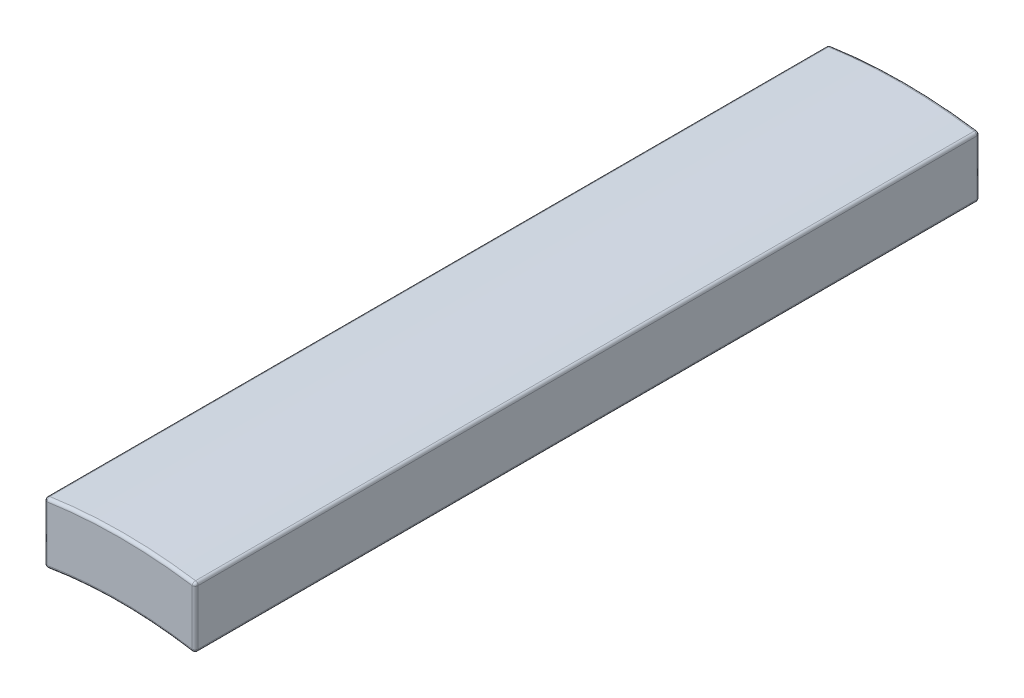
ISO-10303-21;
HEADER;
FILE_DESCRIPTION(('STEP AP214'),'2;1');
FILE_NAME('part.step','',(''),(''),'','','');
FILE_SCHEMA(('AUTOMOTIVE_DESIGN { 1 0 10303 214 1 1 1 1 }'));
ENDSEC;
DATA;
#1=APPLICATION_CONTEXT('core data for automotive mechanical design processes');
#2=APPLICATION_PROTOCOL_DEFINITION('international standard','automotive_design',2000,#1);
#3=PRODUCT_CONTEXT('',#1,'mechanical');
#4=PRODUCT('Part','Part','',(#3));
#5=PRODUCT_RELATED_PRODUCT_CATEGORY('part','',(#4));
#6=PRODUCT_DEFINITION_FORMATION('','',#4);
#7=PRODUCT_DEFINITION_CONTEXT('part definition',#1,'design');
#8=PRODUCT_DEFINITION('design','',#6,#7);
#9=PRODUCT_DEFINITION_SHAPE('','',#8);
#10=(LENGTH_UNIT() NAMED_UNIT(*) SI_UNIT(.MILLI.,.METRE.));
#11=(NAMED_UNIT(*) PLANE_ANGLE_UNIT() SI_UNIT($,.RADIAN.));
#12=(NAMED_UNIT(*) SI_UNIT($,.STERADIAN.) SOLID_ANGLE_UNIT());
#13=UNCERTAINTY_MEASURE_WITH_UNIT(LENGTH_MEASURE(1.E-05),#10,'distance_accuracy_value','');
#14=(GEOMETRIC_REPRESENTATION_CONTEXT(3) GLOBAL_UNCERTAINTY_ASSIGNED_CONTEXT((#13)) GLOBAL_UNIT_ASSIGNED_CONTEXT((#10,
#11,#12)) REPRESENTATION_CONTEXT('',''));
#15=CARTESIAN_POINT('',(0.,0.,0.));
#16=DIRECTION('',(0.,0.,1.));
#17=DIRECTION('',(1.,0.,0.));
#18=AXIS2_PLACEMENT_3D('',#15,#16,#17);
#19=CARTESIAN_POINT('',(2.4,14.3,0.1));
#20=DIRECTION('',(0.,1.,0.));
#21=DIRECTION('',(0.,0.,1.));
#22=AXIS2_PLACEMENT_3D('',#19,#20,#21);
#23=CYLINDRICAL_SURFACE('',#22,0.1);
#24=CARTESIAN_POINT('',(2.4,14.3,0.1));
#25=DIRECTION('',(0.,1.,0.));
#26=DIRECTION('',(0.,0.,1.));
#27=AXIS2_PLACEMENT_3D('',#24,#25,#26);
#28=CIRCLE('',#27,0.1);
#29=CARTESIAN_POINT('',(2.5,14.3,0.100000000000006));
#30=VERTEX_POINT('',#29);
#31=CARTESIAN_POINT('',(2.4,14.3,0.));
#32=VERTEX_POINT('',#31);
#33=EDGE_CURVE('E28',#30,#32,#28,.T.);
#34=ORIENTED_EDGE('',*,*,#33,.T.);
#35=DIRECTION('',(0.,-1.,0.));
#36=VECTOR('',#35,1.);
#37=CARTESIAN_POINT('',(2.4,14.3,0.));
#38=LINE('',#37,#36);
#39=CARTESIAN_POINT('',(2.4,16.1223447426235,0.));
#40=VERTEX_POINT('',#39);
#41=EDGE_CURVE('E205',#40,#32,#38,.T.);
#42=ORIENTED_EDGE('',*,*,#41,.F.);
#43=CARTESIAN_POINT('',(2.4,16.1223447426235,0.1));
#44=DIRECTION('',(0.,-1.,0.));
#45=DIRECTION('',(0.,0.,-1.));
#46=AXIS2_PLACEMENT_3D('',#43,#44,#45);
#47=CIRCLE('',#46,0.1);
#48=CARTESIAN_POINT('',(2.5,16.1223447426235,0.100000000000006));
#49=VERTEX_POINT('',#48);
#50=EDGE_CURVE('E11',#40,#49,#47,.T.);
#51=ORIENTED_EDGE('',*,*,#50,.T.);
#52=DIRECTION('',(0.,1.,0.));
#53=VECTOR('',#52,1.);
#54=CARTESIAN_POINT('',(2.5,14.3,0.1));
#55=LINE('',#54,#53);
#56=EDGE_CURVE('E192',#30,#49,#55,.T.);
#57=ORIENTED_EDGE('',*,*,#56,.F.);
#58=EDGE_LOOP('',(#34,#42,#51,#57));
#59=FACE_BOUND('',#58,.T.);
#60=ADVANCED_FACE('F17',(#59),#23,.T.);
#61=CARTESIAN_POINT('',(2.4,16.1223447426235,0.1));
#62=DIRECTION('',(0.,1.,0.));
#63=DIRECTION('',(1.,0.,0.));
#64=AXIS2_PLACEMENT_3D('',#61,#62,#63);
#65=SPHERICAL_SURFACE('',#64,0.1);
#66=CARTESIAN_POINT('',(2.4,16.1223447426235,0.1));
#67=DIRECTION('',(0.98910090445543,-0.147239263803684,0.));
#68=DIRECTION('',(0.147239263803684,0.98910090445543,0.));
#69=AXIS2_PLACEMENT_3D('',#66,#67,#68);
#70=CIRCLE('',#69,0.1);
#71=CARTESIAN_POINT('',(2.41472392638037,16.2212548330691,0.100000000000006));
#72=VERTEX_POINT('',#71);
#73=EDGE_CURVE('E151',#40,#72,#70,.T.);
#74=ORIENTED_EDGE('',*,*,#73,.T.);
#75=CARTESIAN_POINT('',(2.4,16.1223447426235,0.1));
#76=DIRECTION('',(0.,0.,1.));
#77=DIRECTION('',(-1.,0.,0.));
#78=AXIS2_PLACEMENT_3D('',#75,#76,#77);
#79=CIRCLE('',#78,0.1);
#80=EDGE_CURVE('E188',#49,#72,#79,.T.);
#81=ORIENTED_EDGE('',*,*,#80,.F.);
#82=ORIENTED_EDGE('',*,*,#50,.F.);
#83=EDGE_LOOP('',(#74,#81,#82));
#84=FACE_BOUND('',#83,.T.);
#85=ADVANCED_FACE('F531',(#84),#65,.T.);
#86=CARTESIAN_POINT('',(2.4,14.3,0.1));
#87=DIRECTION('',(0.,1.,0.));
#88=DIRECTION('',(1.,0.,0.));
#89=AXIS2_PLACEMENT_3D('',#86,#87,#88);
#90=SPHERICAL_SURFACE('',#89,0.1);
#91=CARTESIAN_POINT('',(2.4,14.3,0.1));
#92=DIRECTION('',(0.,0.,1.));
#93=DIRECTION('',(-1.,0.,0.));
#94=AXIS2_PLACEMENT_3D('',#91,#92,#93);
#95=CIRCLE('',#94,0.1);
#96=CARTESIAN_POINT('',(2.38344827586207,14.2013793103448,0.100000000000006));
#97=VERTEX_POINT('',#96);
#98=EDGE_CURVE('E269',#97,#30,#95,.T.);
#99=ORIENTED_EDGE('',*,*,#98,.F.);
#100=CARTESIAN_POINT('',(2.4,14.3,0.1));
#101=DIRECTION('',(0.986206896551724,-0.165517241379312,0.));
#102=DIRECTION('',(0.165517241379312,0.986206896551724,0.));
#103=AXIS2_PLACEMENT_3D('',#100,#101,#102);
#104=CIRCLE('',#103,0.1);
#105=EDGE_CURVE('E283',#97,#32,#104,.T.);
#106=ORIENTED_EDGE('',*,*,#105,.T.);
#107=ORIENTED_EDGE('',*,*,#33,.F.);
#108=EDGE_LOOP('',(#99,#106,#107));
#109=FACE_BOUND('',#108,.T.);
#110=ADVANCED_FACE('F525',(#109),#90,.T.);
#111=CARTESIAN_POINT('',(0.,0.,0.1));
#112=DIRECTION('',(0.,0.,1.));
#113=DIRECTION('',(1.,0.,0.));
#114=AXIS2_PLACEMENT_3D('',#111,#112,#113);
#115=TOROIDAL_SURFACE('',#114,16.3,0.1);
#116=CARTESIAN_POINT('',(-2.4,16.1223447426235,0.1));
#117=DIRECTION('',(0.98910090445543,0.14723926380368,0.));
#118=DIRECTION('',(-0.14723926380368,0.98910090445543,0.));
#119=AXIS2_PLACEMENT_3D('',#116,#117,#118);
#120=CIRCLE('',#119,0.1);
#121=CARTESIAN_POINT('',(-2.4,16.1223447426235,0.));
#122=VERTEX_POINT('',#121);
#123=CARTESIAN_POINT('',(-2.41472392638037,16.2212548330691,0.100000000000006));
#124=VERTEX_POINT('',#123);
#125=EDGE_CURVE('E133',#122,#124,#120,.T.);
#126=ORIENTED_EDGE('',*,*,#125,.T.);
#127=CARTESIAN_POINT('',(0.,0.,0.1));
#128=DIRECTION('',(0.,0.,1.));
#129=DIRECTION('',(1.,0.,0.));
#130=AXIS2_PLACEMENT_3D('',#127,#128,#129);
#131=CIRCLE('',#130,16.4);
#132=EDGE_CURVE('E177',#72,#124,#131,.T.);
#133=ORIENTED_EDGE('',*,*,#132,.F.);
#134=ORIENTED_EDGE('',*,*,#73,.F.);
#135=CARTESIAN_POINT('',(0.,0.,0.));
#136=DIRECTION('',(0.,0.,-1.));
#137=DIRECTION('',(1.,0.,0.));
#138=AXIS2_PLACEMENT_3D('',#135,#136,#137);
#139=CIRCLE('',#138,16.3);
#140=EDGE_CURVE('E210',#122,#40,#139,.T.);
#141=ORIENTED_EDGE('',*,*,#140,.F.);
#142=EDGE_LOOP('',(#126,#133,#134,#141));
#143=FACE_BOUND('',#142,.T.);
#144=ADVANCED_FACE('F530',(#143),#115,.T.);
#145=CARTESIAN_POINT('',(0.,0.,0.1));
#146=DIRECTION('',(0.,0.,1.));
#147=DIRECTION('',(1.,0.,0.));
#148=AXIS2_PLACEMENT_3D('',#145,#146,#147);
#149=TOROIDAL_SURFACE('',#148,14.5,0.1);
#150=CARTESIAN_POINT('',(-2.4,14.3,0.1));
#151=DIRECTION('',(0.986206896551723,0.165517241379316,0.));
#152=DIRECTION('',(-0.165517241379316,0.986206896551723,0.));
#153=AXIS2_PLACEMENT_3D('',#150,#151,#152);
#154=CIRCLE('',#153,0.1);
#155=CARTESIAN_POINT('',(-2.38344827586207,14.2013793103448,0.100000000000006));
#156=VERTEX_POINT('',#155);
#157=CARTESIAN_POINT('',(-2.4,14.3,0.));
#158=VERTEX_POINT('',#157);
#159=EDGE_CURVE('E43',#156,#158,#154,.T.);
#160=ORIENTED_EDGE('',*,*,#159,.T.);
#161=CARTESIAN_POINT('',(0.,0.,0.));
#162=DIRECTION('',(0.,0.,1.));
#163=DIRECTION('',(1.,0.,0.));
#164=AXIS2_PLACEMENT_3D('',#161,#162,#163);
#165=CIRCLE('',#164,14.5);
#166=EDGE_CURVE('E209',#32,#158,#165,.T.);
#167=ORIENTED_EDGE('',*,*,#166,.F.);
#168=ORIENTED_EDGE('',*,*,#105,.F.);
#169=CARTESIAN_POINT('',(0.,0.,0.1));
#170=DIRECTION('',(0.,0.,-1.));
#171=DIRECTION('',(1.,0.,0.));
#172=AXIS2_PLACEMENT_3D('',#169,#170,#171);
#173=CIRCLE('',#172,14.4);
#174=EDGE_CURVE('E294',#156,#97,#173,.T.);
#175=ORIENTED_EDGE('',*,*,#174,.F.);
#176=EDGE_LOOP('',(#160,#167,#168,#175));
#177=FACE_BOUND('',#176,.T.);
#178=ADVANCED_FACE('F19',(#177),#149,.T.);
#179=CARTESIAN_POINT('',(-2.4,16.1223447426235,0.1));
#180=DIRECTION('',(0.,1.,0.));
#181=DIRECTION('',(1.,0.,0.));
#182=AXIS2_PLACEMENT_3D('',#179,#180,#181);
#183=SPHERICAL_SURFACE('',#182,0.1);
#184=CARTESIAN_POINT('',(-2.4,16.1223447426235,0.1));
#185=DIRECTION('',(0.,1.,0.));
#186=DIRECTION('',(0.,0.,1.));
#187=AXIS2_PLACEMENT_3D('',#184,#185,#186);
#188=CIRCLE('',#187,0.1);
#189=CARTESIAN_POINT('',(-2.5,16.1223447426235,0.100000000000006));
#190=VERTEX_POINT('',#189);
#191=EDGE_CURVE('E244',#122,#190,#188,.T.);
#192=ORIENTED_EDGE('',*,*,#191,.T.);
#193=CARTESIAN_POINT('',(-2.4,16.1223447426235,0.1));
#194=DIRECTION('',(0.,0.,1.));
#195=DIRECTION('',(-1.,0.,0.));
#196=AXIS2_PLACEMENT_3D('',#193,#194,#195);
#197=CIRCLE('',#196,0.1);
#198=EDGE_CURVE('E220',#124,#190,#197,.T.);
#199=ORIENTED_EDGE('',*,*,#198,.F.);
#200=ORIENTED_EDGE('',*,*,#125,.F.);
#201=EDGE_LOOP('',(#192,#199,#200));
#202=FACE_BOUND('',#201,.T.);
#203=ADVANCED_FACE('F710',(#202),#183,.T.);
#204=CARTESIAN_POINT('',(-2.4,14.3,0.1));
#205=DIRECTION('',(0.,1.,0.));
#206=DIRECTION('',(1.,0.,0.));
#207=AXIS2_PLACEMENT_3D('',#204,#205,#206);
#208=SPHERICAL_SURFACE('',#207,0.1);
#209=CARTESIAN_POINT('',(-2.4,14.3,0.1));
#210=DIRECTION('',(0.,0.,1.));
#211=DIRECTION('',(-1.,0.,0.));
#212=AXIS2_PLACEMENT_3D('',#209,#210,#211);
#213=CIRCLE('',#212,0.1);
#214=CARTESIAN_POINT('',(-2.5,14.3,0.100000000000006));
#215=VERTEX_POINT('',#214);
#216=EDGE_CURVE('E215',#215,#156,#213,.T.);
#217=ORIENTED_EDGE('',*,*,#216,.F.);
#218=CARTESIAN_POINT('',(-2.4,14.3,0.1));
#219=DIRECTION('',(0.,-1.,0.));
#220=DIRECTION('',(0.,0.,-1.));
#221=AXIS2_PLACEMENT_3D('',#218,#219,#220);
#222=CIRCLE('',#221,0.1);
#223=EDGE_CURVE('E266',#215,#158,#222,.T.);
#224=ORIENTED_EDGE('',*,*,#223,.T.);
#225=ORIENTED_EDGE('',*,*,#159,.F.);
#226=EDGE_LOOP('',(#217,#224,#225));
#227=FACE_BOUND('',#226,.T.);
#228=ADVANCED_FACE('F490',(#227),#208,.T.);
#229=CARTESIAN_POINT('',(-2.4,14.3,0.1));
#230=DIRECTION('',(0.,-1.,0.));
#231=DIRECTION('',(0.,0.,-1.));
#232=AXIS2_PLACEMENT_3D('',#229,#230,#231);
#233=CYLINDRICAL_SURFACE('',#232,0.1);
#234=ORIENTED_EDGE('',*,*,#223,.F.);
#235=DIRECTION('',(0.,-1.,0.));
#236=VECTOR('',#235,1.);
#237=CARTESIAN_POINT('',(-2.5,14.3,0.1));
#238=LINE('',#237,#236);
#239=EDGE_CURVE('E240',#190,#215,#238,.T.);
#240=ORIENTED_EDGE('',*,*,#239,.F.);
#241=ORIENTED_EDGE('',*,*,#191,.F.);
#242=DIRECTION('',(0.,1.,0.));
#243=VECTOR('',#242,1.);
#244=CARTESIAN_POINT('',(-2.4,14.3,0.));
#245=LINE('',#244,#243);
#246=EDGE_CURVE('E259',#158,#122,#245,.T.);
#247=ORIENTED_EDGE('',*,*,#246,.F.);
#248=EDGE_LOOP('',(#234,#240,#241,#247));
#249=FACE_BOUND('',#248,.T.);
#250=ADVANCED_FACE('F484',(#249),#233,.T.);
#251=CARTESIAN_POINT('',(0.,0.,25.9));
#252=DIRECTION('',(0.,0.,1.));
#253=DIRECTION('',(1.,0.,0.));
#254=AXIS2_PLACEMENT_3D('',#251,#252,#253);
#255=TOROIDAL_SURFACE('',#254,14.5,0.1);
#256=CARTESIAN_POINT('',(-2.4,14.3,25.9));
#257=DIRECTION('',(0.986206896551723,0.165517241379316,0.));
#258=DIRECTION('',(-0.165517241379316,0.986206896551723,0.));
#259=AXIS2_PLACEMENT_3D('',#256,#257,#258);
#260=CIRCLE('',#259,0.1);
#261=CARTESIAN_POINT('',(-2.4,14.3,26.));
#262=VERTEX_POINT('',#261);
#263=CARTESIAN_POINT('',(-2.38344827586207,14.2013793103448,25.9));
#264=VERTEX_POINT('',#263);
#265=EDGE_CURVE('E21',#262,#264,#260,.T.);
#266=ORIENTED_EDGE('',*,*,#265,.T.);
#267=CARTESIAN_POINT('',(0.,0.,25.9));
#268=DIRECTION('',(0.,0.,1.));
#269=DIRECTION('',(1.,0.,0.));
#270=AXIS2_PLACEMENT_3D('',#267,#268,#269);
#271=CIRCLE('',#270,14.4);
#272=CARTESIAN_POINT('',(2.38344827586207,14.2013793103448,25.9));
#273=VERTEX_POINT('',#272);
#274=EDGE_CURVE('E290',#273,#264,#271,.T.);
#275=ORIENTED_EDGE('',*,*,#274,.F.);
#276=CARTESIAN_POINT('',(2.4,14.3,25.9));
#277=DIRECTION('',(-0.986206896551725,0.165517241379303,0.));
#278=DIRECTION('',(-0.165517241379303,-0.986206896551725,0.));
#279=AXIS2_PLACEMENT_3D('',#276,#277,#278);
#280=CIRCLE('',#279,0.1);
#281=CARTESIAN_POINT('',(2.4,14.3,26.));
#282=VERTEX_POINT('',#281);
#283=EDGE_CURVE('E237',#273,#282,#280,.T.);
#284=ORIENTED_EDGE('',*,*,#283,.T.);
#285=CARTESIAN_POINT('',(0.,0.,26.));
#286=DIRECTION('',(0.,0.,-1.));
#287=DIRECTION('',(1.,0.,0.));
#288=AXIS2_PLACEMENT_3D('',#285,#286,#287);
#289=CIRCLE('',#288,14.5);
#290=EDGE_CURVE('E250',#262,#282,#289,.T.);
#291=ORIENTED_EDGE('',*,*,#290,.F.);
#292=EDGE_LOOP('',(#266,#275,#284,#291));
#293=FACE_BOUND('',#292,.T.);
#294=ADVANCED_FACE('F489',(#293),#255,.T.);
#295=CARTESIAN_POINT('',(2.4,14.3,25.9));
#296=DIRECTION('',(0.,1.,0.));
#297=DIRECTION('',(1.,0.,0.));
#298=AXIS2_PLACEMENT_3D('',#295,#296,#297);
#299=SPHERICAL_SURFACE('',#298,0.1);
#300=CARTESIAN_POINT('',(2.4,14.3,25.9));
#301=DIRECTION('',(0.,0.,-1.));
#302=DIRECTION('',(-1.,0.,0.));
#303=AXIS2_PLACEMENT_3D('',#300,#301,#302);
#304=CIRCLE('',#303,0.1);
#305=CARTESIAN_POINT('',(2.5,14.3,25.9));
#306=VERTEX_POINT('',#305);
#307=EDGE_CURVE('E199',#306,#273,#304,.T.);
#308=ORIENTED_EDGE('',*,*,#307,.F.);
#309=CARTESIAN_POINT('',(2.4,14.3,25.9));
#310=DIRECTION('',(0.,-1.,0.));
#311=DIRECTION('',(0.,0.,-1.));
#312=AXIS2_PLACEMENT_3D('',#309,#310,#311);
#313=CIRCLE('',#312,0.1);
#314=EDGE_CURVE('E183',#306,#282,#313,.T.);
#315=ORIENTED_EDGE('',*,*,#314,.T.);
#316=ORIENTED_EDGE('',*,*,#283,.F.);
#317=EDGE_LOOP('',(#308,#315,#316));
#318=FACE_BOUND('',#317,.T.);
#319=ADVANCED_FACE('F517',(#318),#299,.T.);
#320=CARTESIAN_POINT('',(-2.4,14.3,25.9));
#321=DIRECTION('',(0.,1.,0.));
#322=DIRECTION('',(1.,0.,0.));
#323=AXIS2_PLACEMENT_3D('',#320,#321,#322);
#324=SPHERICAL_SURFACE('',#323,0.1);
#325=CARTESIAN_POINT('',(-2.4,14.3,25.9));
#326=DIRECTION('',(0.,-1.,0.));
#327=DIRECTION('',(0.,0.,-1.));
#328=AXIS2_PLACEMENT_3D('',#325,#326,#327);
#329=CIRCLE('',#328,0.1);
#330=CARTESIAN_POINT('',(-2.5,14.3,25.9));
#331=VERTEX_POINT('',#330);
#332=EDGE_CURVE('E164',#262,#331,#329,.T.);
#333=ORIENTED_EDGE('',*,*,#332,.T.);
#334=CARTESIAN_POINT('',(-2.4,14.3,25.9));
#335=DIRECTION('',(0.,0.,-1.));
#336=DIRECTION('',(-1.,0.,0.));
#337=AXIS2_PLACEMENT_3D('',#334,#335,#336);
#338=CIRCLE('',#337,0.1);
#339=EDGE_CURVE('E324',#264,#331,#338,.T.);
#340=ORIENTED_EDGE('',*,*,#339,.F.);
#341=ORIENTED_EDGE('',*,*,#265,.F.);
#342=EDGE_LOOP('',(#333,#340,#341));
#343=FACE_BOUND('',#342,.T.);
#344=ADVANCED_FACE('F575',(#343),#324,.T.);
#345=CARTESIAN_POINT('',(2.4,14.3,25.9));
#346=DIRECTION('',(0.,-1.,0.));
#347=DIRECTION('',(0.,0.,-1.));
#348=AXIS2_PLACEMENT_3D('',#345,#346,#347);
#349=CYLINDRICAL_SURFACE('',#348,0.1);
#350=CARTESIAN_POINT('',(2.4,16.1223447426235,25.9));
#351=DIRECTION('',(0.,-1.,0.));
#352=DIRECTION('',(0.,0.,-1.));
#353=AXIS2_PLACEMENT_3D('',#350,#351,#352);
#354=CIRCLE('',#353,0.1);
#355=CARTESIAN_POINT('',(2.5,16.1223447426235,25.9));
#356=VERTEX_POINT('',#355);
#357=CARTESIAN_POINT('',(2.4,16.1223447426235,26.));
#358=VERTEX_POINT('',#357);
#359=EDGE_CURVE('E125',#356,#358,#354,.T.);
#360=ORIENTED_EDGE('',*,*,#359,.T.);
#361=DIRECTION('',(0.,1.,0.));
#362=VECTOR('',#361,1.);
#363=CARTESIAN_POINT('',(2.4,16.1223447426235,26.));
#364=LINE('',#363,#362);
#365=EDGE_CURVE('E254',#282,#358,#364,.T.);
#366=ORIENTED_EDGE('',*,*,#365,.F.);
#367=ORIENTED_EDGE('',*,*,#314,.F.);
#368=DIRECTION('',(0.,-1.,0.));
#369=VECTOR('',#368,1.);
#370=CARTESIAN_POINT('',(2.5,14.3,25.9));
#371=LINE('',#370,#369);
#372=EDGE_CURVE('E180',#356,#306,#371,.T.);
#373=ORIENTED_EDGE('',*,*,#372,.F.);
#374=EDGE_LOOP('',(#360,#366,#367,#373));
#375=FACE_BOUND('',#374,.T.);
#376=ADVANCED_FACE('F181',(#375),#349,.T.);
#377=CARTESIAN_POINT('',(-2.4,14.3,25.9));
#378=DIRECTION('',(0.,1.,0.));
#379=DIRECTION('',(0.,0.,1.));
#380=AXIS2_PLACEMENT_3D('',#377,#378,#379);
#381=CYLINDRICAL_SURFACE('',#380,0.1);
#382=CARTESIAN_POINT('',(-2.4,16.1223447426235,25.9));
#383=DIRECTION('',(0.,-1.,0.));
#384=DIRECTION('',(0.,0.,-1.));
#385=AXIS2_PLACEMENT_3D('',#382,#383,#384);
#386=CIRCLE('',#385,0.1);
#387=CARTESIAN_POINT('',(-2.4,16.1223447426235,26.));
#388=VERTEX_POINT('',#387);
#389=CARTESIAN_POINT('',(-2.5,16.1223447426235,25.9));
#390=VERTEX_POINT('',#389);
#391=EDGE_CURVE('E165',#388,#390,#386,.T.);
#392=ORIENTED_EDGE('',*,*,#391,.T.);
#393=DIRECTION('',(0.,1.,0.));
#394=VECTOR('',#393,1.);
#395=CARTESIAN_POINT('',(-2.5,16.1223447426235,25.9));
#396=LINE('',#395,#394);
#397=EDGE_CURVE('E211',#331,#390,#396,.T.);
#398=ORIENTED_EDGE('',*,*,#397,.F.);
#399=ORIENTED_EDGE('',*,*,#332,.F.);
#400=DIRECTION('',(0.,-1.,0.));
#401=VECTOR('',#400,1.);
#402=CARTESIAN_POINT('',(-2.4,14.3,26.));
#403=LINE('',#402,#401);
#404=EDGE_CURVE('E255',#388,#262,#403,.T.);
#405=ORIENTED_EDGE('',*,*,#404,.F.);
#406=EDGE_LOOP('',(#392,#398,#399,#405));
#407=FACE_BOUND('',#406,.T.);
#408=ADVANCED_FACE('F611',(#407),#381,.T.);
#409=CARTESIAN_POINT('',(2.4,16.1223447426235,25.9));
#410=DIRECTION('',(0.,1.,0.));
#411=DIRECTION('',(1.,0.,0.));
#412=AXIS2_PLACEMENT_3D('',#409,#410,#411);
#413=SPHERICAL_SURFACE('',#412,0.1);
#414=CARTESIAN_POINT('',(2.4,16.1223447426235,25.9));
#415=DIRECTION('',(0.,0.,-1.));
#416=DIRECTION('',(-1.,0.,0.));
#417=AXIS2_PLACEMENT_3D('',#414,#415,#416);
#418=CIRCLE('',#417,0.1);
#419=CARTESIAN_POINT('',(2.41472392638037,16.2212548330691,25.9));
#420=VERTEX_POINT('',#419);
#421=EDGE_CURVE('E159',#420,#356,#418,.T.);
#422=ORIENTED_EDGE('',*,*,#421,.F.);
#423=CARTESIAN_POINT('',(2.4,16.1223447426235,25.9));
#424=DIRECTION('',(0.98910090445543,-0.14723926380368,0.));
#425=DIRECTION('',(0.14723926380368,0.98910090445543,0.));
#426=AXIS2_PLACEMENT_3D('',#423,#424,#425);
#427=CIRCLE('',#426,0.1);
#428=EDGE_CURVE('E161',#420,#358,#427,.T.);
#429=ORIENTED_EDGE('',*,*,#428,.T.);
#430=ORIENTED_EDGE('',*,*,#359,.F.);
#431=EDGE_LOOP('',(#422,#429,#430));
#432=FACE_BOUND('',#431,.T.);
#433=ADVANCED_FACE('F158',(#432),#413,.T.);
#434=CARTESIAN_POINT('',(-2.4,16.1223447426235,25.9));
#435=DIRECTION('',(0.,1.,0.));
#436=DIRECTION('',(1.,0.,0.));
#437=AXIS2_PLACEMENT_3D('',#434,#435,#436);
#438=SPHERICAL_SURFACE('',#437,0.1);
#439=CARTESIAN_POINT('',(-2.4,16.1223447426235,25.9));
#440=DIRECTION('',(-0.98910090445543,-0.14723926380368,0.));
#441=DIRECTION('',(0.14723926380368,-0.98910090445543,0.));
#442=AXIS2_PLACEMENT_3D('',#439,#440,#441);
#443=CIRCLE('',#442,0.1);
#444=CARTESIAN_POINT('',(-2.41472392638037,16.2212548330691,25.9));
#445=VERTEX_POINT('',#444);
#446=EDGE_CURVE('E275',#388,#445,#443,.T.);
#447=ORIENTED_EDGE('',*,*,#446,.T.);
#448=CARTESIAN_POINT('',(-2.4,16.1223447426235,25.9));
#449=DIRECTION('',(0.,0.,-1.));
#450=DIRECTION('',(-1.,0.,0.));
#451=AXIS2_PLACEMENT_3D('',#448,#449,#450);
#452=CIRCLE('',#451,0.1);
#453=EDGE_CURVE('E316',#390,#445,#452,.T.);
#454=ORIENTED_EDGE('',*,*,#453,.F.);
#455=ORIENTED_EDGE('',*,*,#391,.F.);
#456=EDGE_LOOP('',(#447,#454,#455));
#457=FACE_BOUND('',#456,.T.);
#458=ADVANCED_FACE('F557',(#457),#438,.T.);
#459=CARTESIAN_POINT('',(0.,0.,25.9));
#460=DIRECTION('',(0.,0.,1.));
#461=DIRECTION('',(1.,0.,0.));
#462=AXIS2_PLACEMENT_3D('',#459,#460,#461);
#463=TOROIDAL_SURFACE('',#462,16.3,0.1);
#464=ORIENTED_EDGE('',*,*,#428,.F.);
#465=CARTESIAN_POINT('',(0.,0.,25.9));
#466=DIRECTION('',(0.,0.,-1.));
#467=DIRECTION('',(1.,0.,0.));
#468=AXIS2_PLACEMENT_3D('',#465,#466,#467);
#469=CIRCLE('',#468,16.4);
#470=EDGE_CURVE('E217',#445,#420,#469,.T.);
#471=ORIENTED_EDGE('',*,*,#470,.F.);
#472=ORIENTED_EDGE('',*,*,#446,.F.);
#473=CARTESIAN_POINT('',(0.,0.,26.));
#474=DIRECTION('',(0.,0.,1.));
#475=DIRECTION('',(1.,0.,0.));
#476=AXIS2_PLACEMENT_3D('',#473,#474,#475);
#477=CIRCLE('',#476,16.3);
#478=EDGE_CURVE('E203',#358,#388,#477,.T.);
#479=ORIENTED_EDGE('',*,*,#478,.F.);
#480=EDGE_LOOP('',(#464,#471,#472,#479));
#481=FACE_BOUND('',#480,.T.);
#482=ADVANCED_FACE('F505',(#481),#463,.T.);
#483=CARTESIAN_POINT('',(2.4,14.3,0.));
#484=DIRECTION('',(0.,0.,1.));
#485=DIRECTION('',(1.,0.,0.));
#486=AXIS2_PLACEMENT_3D('',#483,#484,#485);
#487=PLANE('',#486);
#488=ORIENTED_EDGE('',*,*,#140,.T.);
#489=ORIENTED_EDGE('',*,*,#41,.T.);
#490=ORIENTED_EDGE('',*,*,#166,.T.);
#491=ORIENTED_EDGE('',*,*,#246,.T.);
#492=EDGE_LOOP('',(#488,#489,#490,#491));
#493=FACE_BOUND('',#492,.T.);
#494=ADVANCED_FACE('F499',(#493),#487,.F.);
#495=CARTESIAN_POINT('',(2.4,14.3,26.));
#496=DIRECTION('',(0.,0.,1.));
#497=DIRECTION('',(1.,0.,0.));
#498=AXIS2_PLACEMENT_3D('',#495,#496,#497);
#499=PLANE('',#498);
#500=ORIENTED_EDGE('',*,*,#404,.T.);
#501=ORIENTED_EDGE('',*,*,#290,.T.);
#502=ORIENTED_EDGE('',*,*,#365,.T.);
#503=ORIENTED_EDGE('',*,*,#478,.T.);
#504=EDGE_LOOP('',(#500,#501,#502,#503));
#505=FACE_BOUND('',#504,.T.);
#506=ADVANCED_FACE('F504',(#505),#499,.T.);
#507=CARTESIAN_POINT('',(0.,0.,26.));
#508=DIRECTION('',(0.,0.,-1.));
#509=DIRECTION('',(-1.,0.,0.));
#510=AXIS2_PLACEMENT_3D('',#507,#508,#509);
#511=CYLINDRICAL_SURFACE('',#510,14.4);
#512=DIRECTION('',(0.,0.,-1.));
#513=VECTOR('',#512,1.);
#514=CARTESIAN_POINT('',(-2.38344827586207,14.2013793103448,26.));
#515=LINE('',#514,#513);
#516=EDGE_CURVE('E303',#264,#156,#515,.T.);
#517=ORIENTED_EDGE('',*,*,#516,.T.);
#518=ORIENTED_EDGE('',*,*,#174,.T.);
#519=DIRECTION('',(0.,0.,-1.));
#520=VECTOR('',#519,1.);
#521=CARTESIAN_POINT('',(2.38344827586207,14.2013793103448,26.));
#522=LINE('',#521,#520);
#523=EDGE_CURVE('E274',#273,#97,#522,.T.);
#524=ORIENTED_EDGE('',*,*,#523,.F.);
#525=ORIENTED_EDGE('',*,*,#274,.T.);
#526=EDGE_LOOP('',(#517,#518,#524,#525));
#527=FACE_BOUND('',#526,.T.);
#528=ADVANCED_FACE('F586',(#527),#511,.F.);
#529=CARTESIAN_POINT('',(-2.4,14.3,26.));
#530=DIRECTION('',(0.,0.,-1.));
#531=DIRECTION('',(-1.,0.,0.));
#532=AXIS2_PLACEMENT_3D('',#529,#530,#531);
#533=CYLINDRICAL_SURFACE('',#532,0.1);
#534=DIRECTION('',(0.,0.,-1.));
#535=VECTOR('',#534,1.);
#536=CARTESIAN_POINT('',(-2.5,14.3,26.));
#537=LINE('',#536,#535);
#538=EDGE_CURVE('E216',#331,#215,#537,.T.);
#539=ORIENTED_EDGE('',*,*,#538,.T.);
#540=ORIENTED_EDGE('',*,*,#216,.T.);
#541=ORIENTED_EDGE('',*,*,#516,.F.);
#542=ORIENTED_EDGE('',*,*,#339,.T.);
#543=EDGE_LOOP('',(#539,#540,#541,#542));
#544=FACE_BOUND('',#543,.T.);
#545=ADVANCED_FACE('F591',(#544),#533,.T.);
#546=CARTESIAN_POINT('',(-2.5,14.3,26.));
#547=DIRECTION('',(1.,0.,0.));
#548=DIRECTION('',(0.,1.,0.));
#549=AXIS2_PLACEMENT_3D('',#546,#547,#548);
#550=PLANE('',#549);
#551=DIRECTION('',(0.,0.,-1.));
#552=VECTOR('',#551,1.);
#553=CARTESIAN_POINT('',(-2.5,16.1223447426235,26.));
#554=LINE('',#553,#552);
#555=EDGE_CURVE('E320',#390,#190,#554,.T.);
#556=ORIENTED_EDGE('',*,*,#555,.T.);
#557=ORIENTED_EDGE('',*,*,#239,.T.);
#558=ORIENTED_EDGE('',*,*,#538,.F.);
#559=ORIENTED_EDGE('',*,*,#397,.T.);
#560=EDGE_LOOP('',(#556,#557,#558,#559));
#561=FACE_BOUND('',#560,.T.);
#562=ADVANCED_FACE('F628',(#561),#550,.F.);
#563=CARTESIAN_POINT('',(-2.4,16.1223447426235,26.));
#564=DIRECTION('',(0.,0.,-1.));
#565=DIRECTION('',(-1.,0.,0.));
#566=AXIS2_PLACEMENT_3D('',#563,#564,#565);
#567=CYLINDRICAL_SURFACE('',#566,0.1);
#568=DIRECTION('',(0.,0.,-1.));
#569=VECTOR('',#568,1.);
#570=CARTESIAN_POINT('',(-2.41472392638037,16.2212548330691,26.));
#571=LINE('',#570,#569);
#572=EDGE_CURVE('E221',#445,#124,#571,.T.);
#573=ORIENTED_EDGE('',*,*,#572,.T.);
#574=ORIENTED_EDGE('',*,*,#198,.T.);
#575=ORIENTED_EDGE('',*,*,#555,.F.);
#576=ORIENTED_EDGE('',*,*,#453,.T.);
#577=EDGE_LOOP('',(#573,#574,#575,#576));
#578=FACE_BOUND('',#577,.T.);
#579=ADVANCED_FACE('F545',(#578),#567,.T.);
#580=CARTESIAN_POINT('',(0.,0.,26.));
#581=DIRECTION('',(0.,0.,-1.));
#582=DIRECTION('',(-1.,0.,0.));
#583=AXIS2_PLACEMENT_3D('',#580,#581,#582);
#584=CYLINDRICAL_SURFACE('',#583,16.4);
#585=DIRECTION('',(0.,0.,-1.));
#586=VECTOR('',#585,1.);
#587=CARTESIAN_POINT('',(2.41472392638037,16.2212548330691,26.));
#588=LINE('',#587,#586);
#589=EDGE_CURVE('E175',#420,#72,#588,.T.);
#590=ORIENTED_EDGE('',*,*,#589,.T.);
#591=ORIENTED_EDGE('',*,*,#132,.T.);
#592=ORIENTED_EDGE('',*,*,#572,.F.);
#593=ORIENTED_EDGE('',*,*,#470,.T.);
#594=EDGE_LOOP('',(#590,#591,#592,#593));
#595=FACE_BOUND('',#594,.T.);
#596=ADVANCED_FACE('F540',(#595),#584,.T.);
#597=CARTESIAN_POINT('',(2.4,16.1223447426235,26.));
#598=DIRECTION('',(0.,0.,-1.));
#599=DIRECTION('',(-1.,0.,0.));
#600=AXIS2_PLACEMENT_3D('',#597,#598,#599);
#601=CYLINDRICAL_SURFACE('',#600,0.1);
#602=DIRECTION('',(0.,0.,-1.));
#603=VECTOR('',#602,1.);
#604=CARTESIAN_POINT('',(2.5,16.1223447426235,26.));
#605=LINE('',#604,#603);
#606=EDGE_CURVE('E172',#356,#49,#605,.T.);
#607=ORIENTED_EDGE('',*,*,#606,.T.);
#608=ORIENTED_EDGE('',*,*,#80,.T.);
#609=ORIENTED_EDGE('',*,*,#589,.F.);
#610=ORIENTED_EDGE('',*,*,#421,.T.);
#611=EDGE_LOOP('',(#607,#608,#609,#610));
#612=FACE_BOUND('',#611,.T.);
#613=ADVANCED_FACE('F169',(#612),#601,.T.);
#614=CARTESIAN_POINT('',(2.5,14.3,26.));
#615=DIRECTION('',(-1.,0.,0.));
#616=DIRECTION('',(0.,0.,1.));
#617=AXIS2_PLACEMENT_3D('',#614,#615,#616);
#618=PLANE('',#617);
#619=DIRECTION('',(0.,0.,-1.));
#620=VECTOR('',#619,1.);
#621=CARTESIAN_POINT('',(2.5,14.3,26.));
#622=LINE('',#621,#620);
#623=EDGE_CURVE('E273',#306,#30,#622,.T.);
#624=ORIENTED_EDGE('',*,*,#623,.T.);
#625=ORIENTED_EDGE('',*,*,#56,.T.);
#626=ORIENTED_EDGE('',*,*,#606,.F.);
#627=ORIENTED_EDGE('',*,*,#372,.T.);
#628=EDGE_LOOP('',(#624,#625,#626,#627));
#629=FACE_BOUND('',#628,.T.);
#630=ADVANCED_FACE('F190',(#629),#618,.F.);
#631=CARTESIAN_POINT('',(2.4,14.3,26.));
#632=DIRECTION('',(0.,0.,-1.));
#633=DIRECTION('',(-1.,0.,0.));
#634=AXIS2_PLACEMENT_3D('',#631,#632,#633);
#635=CYLINDRICAL_SURFACE('',#634,0.1);
#636=ORIENTED_EDGE('',*,*,#523,.T.);
#637=ORIENTED_EDGE('',*,*,#98,.T.);
#638=ORIENTED_EDGE('',*,*,#623,.F.);
#639=ORIENTED_EDGE('',*,*,#307,.T.);
#640=EDGE_LOOP('',(#636,#637,#638,#639));
#641=FACE_BOUND('',#640,.T.);
#642=ADVANCED_FACE('F665',(#641),#635,.T.);
#643=CLOSED_SHELL('',(#60,#85,#110,#144,#178,#203,#228,#250,#294,#319,#344,#376,#408,#433,#458,
#482,#494,#506,#528,#545,#562,#579,#596,#613,#630,#642));
#644=MANIFOLD_SOLID_BREP('B1',#643);
#645=ADVANCED_BREP_SHAPE_REPRESENTATION('',(#18,#644),#14);
#646=SHAPE_DEFINITION_REPRESENTATION(#9,#645);
ENDSEC;
END-ISO-10303-21;
